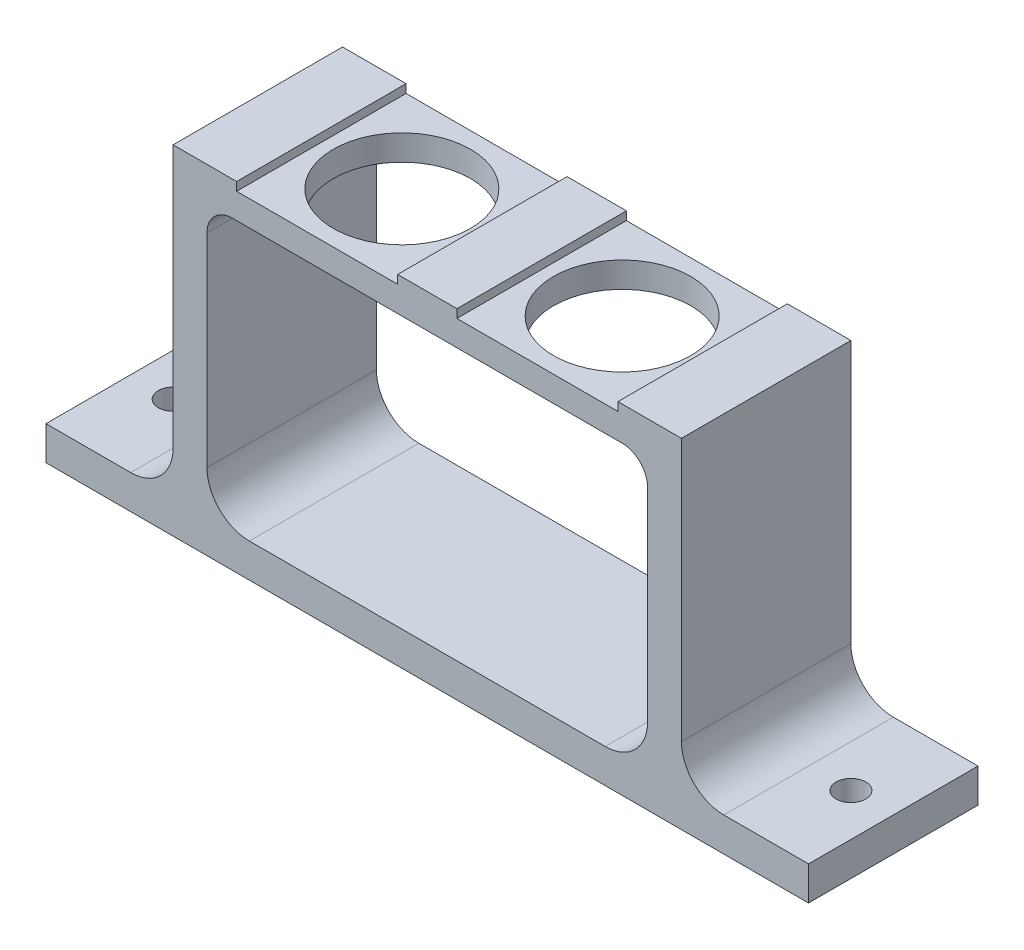
ISO-10303-21;
HEADER;
FILE_DESCRIPTION(('STEP AP214'),'2;1');
FILE_NAME('part.step','',(''),(''),'','','');
FILE_SCHEMA(('AUTOMOTIVE_DESIGN { 1 0 10303 214 1 1 1 1 }'));
ENDSEC;
DATA;
#1=APPLICATION_CONTEXT('core data for automotive mechanical design processes');
#2=APPLICATION_PROTOCOL_DEFINITION('international standard','automotive_design',2000,#1);
#3=PRODUCT_CONTEXT('',#1,'mechanical');
#4=PRODUCT('Part','Part','',(#3));
#5=PRODUCT_RELATED_PRODUCT_CATEGORY('part','',(#4));
#6=PRODUCT_DEFINITION_FORMATION('','',#4);
#7=PRODUCT_DEFINITION_CONTEXT('part definition',#1,'design');
#8=PRODUCT_DEFINITION('design','',#6,#7);
#9=PRODUCT_DEFINITION_SHAPE('','',#8);
#10=(LENGTH_UNIT() NAMED_UNIT(*) SI_UNIT(.MILLI.,.METRE.));
#11=(NAMED_UNIT(*) PLANE_ANGLE_UNIT() SI_UNIT($,.RADIAN.));
#12=(NAMED_UNIT(*) SI_UNIT($,.STERADIAN.) SOLID_ANGLE_UNIT());
#13=UNCERTAINTY_MEASURE_WITH_UNIT(LENGTH_MEASURE(1.E-05),#10,'distance_accuracy_value','');
#14=(GEOMETRIC_REPRESENTATION_CONTEXT(3) GLOBAL_UNCERTAINTY_ASSIGNED_CONTEXT((#13)) GLOBAL_UNIT_ASSIGNED_CONTEXT((#10,
#11,#12)) REPRESENTATION_CONTEXT('',''));
#15=CARTESIAN_POINT('',(0.,0.,0.));
#16=DIRECTION('',(0.,0.,1.));
#17=DIRECTION('',(1.,0.,0.));
#18=AXIS2_PLACEMENT_3D('',#15,#16,#17);
#19=CARTESIAN_POINT('',(0.,40.,0.));
#20=DIRECTION('',(0.,1.,0.));
#21=DIRECTION('',(0.,0.,1.));
#22=AXIS2_PLACEMENT_3D('',#19,#20,#21);
#23=PLANE('',#22);
#24=DIRECTION('',(0.,0.,-1.));
#25=VECTOR('',#24,1.);
#26=CARTESIAN_POINT('',(41.5,40.,0.));
#27=LINE('',#26,#25);
#28=CARTESIAN_POINT('',(41.5,40.,0.));
#29=VERTEX_POINT('',#28);
#30=CARTESIAN_POINT('',(41.5,40.,-20.));
#31=VERTEX_POINT('',#30);
#32=EDGE_CURVE('E213',#29,#31,#27,.T.);
#33=ORIENTED_EDGE('',*,*,#32,.F.);
#34=DIRECTION('',(1.,0.,0.));
#35=VECTOR('',#34,1.);
#36=CARTESIAN_POINT('',(15.,40.,0.));
#37=LINE('',#36,#35);
#38=CARTESIAN_POINT('',(48.5,40.,0.));
#39=VERTEX_POINT('',#38);
#40=EDGE_CURVE('E287',#29,#39,#37,.T.);
#41=ORIENTED_EDGE('',*,*,#40,.T.);
#42=DIRECTION('',(0.,0.,1.));
#43=VECTOR('',#42,1.);
#44=CARTESIAN_POINT('',(48.5,40.,0.));
#45=LINE('',#44,#43);
#46=CARTESIAN_POINT('',(48.5,40.,-20.));
#47=VERTEX_POINT('',#46);
#48=EDGE_CURVE('E251',#47,#39,#45,.T.);
#49=ORIENTED_EDGE('',*,*,#48,.F.);
#50=DIRECTION('',(-1.,0.,0.));
#51=VECTOR('',#50,1.);
#52=CARTESIAN_POINT('',(15.,40.,-20.));
#53=LINE('',#52,#51);
#54=EDGE_CURVE('E295',#47,#31,#53,.T.);
#55=ORIENTED_EDGE('',*,*,#54,.T.);
#56=EDGE_LOOP('',(#33,#41,#49,#55));
#57=FACE_BOUND('',#56,.T.);
#58=ADVANCED_FACE('F34',(#57),#23,.T.);
#59=DIRECTION('',(0.,0.,-1.));
#60=VECTOR('',#59,1.);
#61=CARTESIAN_POINT('',(67.5,40.,0.));
#62=LINE('',#61,#60);
#63=CARTESIAN_POINT('',(67.5,40.,0.));
#64=VERTEX_POINT('',#63);
#65=CARTESIAN_POINT('',(67.5,40.,-20.));
#66=VERTEX_POINT('',#65);
#67=EDGE_CURVE('E261',#64,#66,#62,.T.);
#68=ORIENTED_EDGE('',*,*,#67,.F.);
#69=CARTESIAN_POINT('',(75.,40.,0.));
#70=VERTEX_POINT('',#69);
#71=EDGE_CURVE('E281',#64,#70,#37,.T.);
#72=ORIENTED_EDGE('',*,*,#71,.T.);
#73=DIRECTION('',(0.,0.,-1.));
#74=VECTOR('',#73,1.);
#75=CARTESIAN_POINT('',(75.,40.,-20.));
#76=LINE('',#75,#74);
#77=CARTESIAN_POINT('',(75.,40.,-20.));
#78=VERTEX_POINT('',#77);
#79=EDGE_CURVE('E286',#70,#78,#76,.T.);
#80=ORIENTED_EDGE('',*,*,#79,.T.);
#81=EDGE_CURVE('E291',#78,#66,#53,.T.);
#82=ORIENTED_EDGE('',*,*,#81,.T.);
#83=EDGE_LOOP('',(#68,#72,#80,#82));
#84=FACE_BOUND('',#83,.T.);
#85=ADVANCED_FACE('F495',(#84),#23,.T.);
#86=CARTESIAN_POINT('',(0.,4.,0.));
#87=DIRECTION('',(0.,-1.,0.));
#88=DIRECTION('',(0.,0.,-1.));
#89=AXIS2_PLACEMENT_3D('',#86,#87,#88);
#90=PLANE('',#89);
#91=CARTESIAN_POINT('',(85.,4.,-10.));
#92=DIRECTION('',(0.,1.,0.));
#93=DIRECTION('',(0.,0.,1.));
#94=AXIS2_PLACEMENT_3D('',#91,#92,#93);
#95=CIRCLE('',#94,1.75);
#96=CARTESIAN_POINT('',(85.,4.,-8.25000000000001));
#97=VERTEX_POINT('',#96);
#98=EDGE_CURVE('E326',#97,#97,#95,.T.);
#99=ORIENTED_EDGE('',*,*,#98,.F.);
#100=EDGE_LOOP('',(#99));
#101=FACE_BOUND('',#100,.T.);
#102=DIRECTION('',(-1.,0.,0.));
#103=VECTOR('',#102,1.);
#104=CARTESIAN_POINT('',(0.,4.,-20.));
#105=LINE('',#104,#103);
#106=CARTESIAN_POINT('',(90.,4.,-20.));
#107=VERTEX_POINT('',#106);
#108=CARTESIAN_POINT('',(80.,4.,-20.));
#109=VERTEX_POINT('',#108);
#110=EDGE_CURVE('E344',#107,#109,#105,.T.);
#111=ORIENTED_EDGE('',*,*,#110,.T.);
#112=DIRECTION('',(0.,0.,-1.));
#113=VECTOR('',#112,1.);
#114=CARTESIAN_POINT('',(80.,4.,0.));
#115=LINE('',#114,#113);
#116=CARTESIAN_POINT('',(80.,4.,0.));
#117=VERTEX_POINT('',#116);
#118=EDGE_CURVE('E370',#109,#117,#115,.F.);
#119=ORIENTED_EDGE('',*,*,#118,.T.);
#120=DIRECTION('',(1.,0.,0.));
#121=VECTOR('',#120,1.);
#122=CARTESIAN_POINT('',(0.,4.,0.));
#123=LINE('',#122,#121);
#124=CARTESIAN_POINT('',(90.,4.,0.));
#125=VERTEX_POINT('',#124);
#126=EDGE_CURVE('E335',#117,#125,#123,.T.);
#127=ORIENTED_EDGE('',*,*,#126,.T.);
#128=DIRECTION('',(0.,0.,-1.));
#129=VECTOR('',#128,1.);
#130=CARTESIAN_POINT('',(90.,4.,0.));
#131=LINE('',#130,#129);
#132=EDGE_CURVE('E340',#125,#107,#131,.T.);
#133=ORIENTED_EDGE('',*,*,#132,.T.);
#134=EDGE_LOOP('',(#111,#119,#127,#133));
#135=FACE_BOUND('',#134,.T.);
#136=ADVANCED_FACE('F472',(#101,#135),#90,.F.);
#137=CARTESIAN_POINT('',(24.,4.,0.));
#138=VERTEX_POINT('',#137);
#139=CARTESIAN_POINT('',(66.,4.,0.));
#140=VERTEX_POINT('',#139);
#141=EDGE_CURVE('E341',#138,#140,#123,.T.);
#142=ORIENTED_EDGE('',*,*,#141,.T.);
#143=DIRECTION('',(0.,0.,1.));
#144=VECTOR('',#143,1.);
#145=CARTESIAN_POINT('',(66.,4.,-20.));
#146=LINE('',#145,#144);
#147=CARTESIAN_POINT('',(66.,4.,-20.));
#148=VERTEX_POINT('',#147);
#149=EDGE_CURVE('E377',#140,#148,#146,.F.);
#150=ORIENTED_EDGE('',*,*,#149,.T.);
#151=CARTESIAN_POINT('',(24.,4.,-20.));
#152=VERTEX_POINT('',#151);
#153=EDGE_CURVE('E348',#148,#152,#105,.T.);
#154=ORIENTED_EDGE('',*,*,#153,.T.);
#155=DIRECTION('',(0.,0.,-1.));
#156=VECTOR('',#155,1.);
#157=CARTESIAN_POINT('',(24.,4.,0.));
#158=LINE('',#157,#156);
#159=EDGE_CURVE('E375',#152,#138,#158,.F.);
#160=ORIENTED_EDGE('',*,*,#159,.T.);
#161=EDGE_LOOP('',(#142,#150,#154,#160));
#162=FACE_BOUND('',#161,.T.);
#163=ADVANCED_FACE('F465',(#162),#90,.F.);
#164=CARTESIAN_POINT('',(4.99999999999999,4.,-10.));
#165=DIRECTION('',(0.,1.,0.));
#166=DIRECTION('',(0.,0.,-1.));
#167=AXIS2_PLACEMENT_3D('',#164,#165,#166);
#168=CIRCLE('',#167,1.75);
#169=CARTESIAN_POINT('',(4.99999999999999,4.,-11.75));
#170=VERTEX_POINT('',#169);
#171=EDGE_CURVE('E320',#170,#170,#168,.T.);
#172=ORIENTED_EDGE('',*,*,#171,.F.);
#173=EDGE_LOOP('',(#172));
#174=FACE_BOUND('',#173,.T.);
#175=CARTESIAN_POINT('',(0.,4.,0.));
#176=VERTEX_POINT('',#175);
#177=CARTESIAN_POINT('',(9.99999999999998,4.,0.));
#178=VERTEX_POINT('',#177);
#179=EDGE_CURVE('E337',#176,#178,#123,.T.);
#180=ORIENTED_EDGE('',*,*,#179,.T.);
#181=DIRECTION('',(0.,0.,1.));
#182=VECTOR('',#181,1.);
#183=CARTESIAN_POINT('',(9.99999999999998,4.,-20.));
#184=LINE('',#183,#182);
#185=CARTESIAN_POINT('',(9.99999999999998,4.,-20.));
#186=VERTEX_POINT('',#185);
#187=EDGE_CURVE('E382',#178,#186,#184,.F.);
#188=ORIENTED_EDGE('',*,*,#187,.T.);
#189=CARTESIAN_POINT('',(0.,4.,-20.));
#190=VERTEX_POINT('',#189);
#191=EDGE_CURVE('E343',#186,#190,#105,.T.);
#192=ORIENTED_EDGE('',*,*,#191,.T.);
#193=DIRECTION('',(0.,0.,1.));
#194=VECTOR('',#193,1.);
#195=CARTESIAN_POINT('',(0.,4.,0.));
#196=LINE('',#195,#194);
#197=EDGE_CURVE('E332',#190,#176,#196,.T.);
#198=ORIENTED_EDGE('',*,*,#197,.T.);
#199=EDGE_LOOP('',(#180,#188,#192,#198));
#200=FACE_BOUND('',#199,.T.);
#201=ADVANCED_FACE('F709',(#174,#200),#90,.F.);
#202=CARTESIAN_POINT('',(0.,0.,0.));
#203=DIRECTION('',(0.,-1.,0.));
#204=DIRECTION('',(0.,0.,-1.));
#205=AXIS2_PLACEMENT_3D('',#202,#203,#204);
#206=PLANE('',#205);
#207=CARTESIAN_POINT('',(85.,0.,-10.));
#208=DIRECTION('',(0.,1.,0.));
#209=DIRECTION('',(0.,0.,1.));
#210=AXIS2_PLACEMENT_3D('',#207,#208,#209);
#211=CIRCLE('',#210,1.75);
#212=CARTESIAN_POINT('',(85.,0.,-8.25000000000001));
#213=VERTEX_POINT('',#212);
#214=EDGE_CURVE('E323',#213,#213,#211,.T.);
#215=ORIENTED_EDGE('',*,*,#214,.T.);
#216=EDGE_LOOP('',(#215));
#217=FACE_BOUND('',#216,.T.);
#218=DIRECTION('',(0.,0.,1.));
#219=VECTOR('',#218,1.);
#220=CARTESIAN_POINT('',(0.,0.,0.));
#221=LINE('',#220,#219);
#222=CARTESIAN_POINT('',(0.,0.,-20.));
#223=VERTEX_POINT('',#222);
#224=CARTESIAN_POINT('',(0.,0.,0.));
#225=VERTEX_POINT('',#224);
#226=EDGE_CURVE('E329',#223,#225,#221,.T.);
#227=ORIENTED_EDGE('',*,*,#226,.F.);
#228=DIRECTION('',(-1.,0.,0.));
#229=VECTOR('',#228,1.);
#230=CARTESIAN_POINT('',(0.,0.,-20.));
#231=LINE('',#230,#229);
#232=CARTESIAN_POINT('',(90.,0.,-20.));
#233=VERTEX_POINT('',#232);
#234=EDGE_CURVE('E336',#233,#223,#231,.T.);
#235=ORIENTED_EDGE('',*,*,#234,.F.);
#236=DIRECTION('',(0.,0.,-1.));
#237=VECTOR('',#236,1.);
#238=CARTESIAN_POINT('',(90.,0.,0.));
#239=LINE('',#238,#237);
#240=CARTESIAN_POINT('',(90.,0.,0.));
#241=VERTEX_POINT('',#240);
#242=EDGE_CURVE('E353',#241,#233,#239,.T.);
#243=ORIENTED_EDGE('',*,*,#242,.F.);
#244=DIRECTION('',(1.,0.,0.));
#245=VECTOR('',#244,1.);
#246=CARTESIAN_POINT('',(0.,0.,0.));
#247=LINE('',#246,#245);
#248=EDGE_CURVE('E351',#225,#241,#247,.T.);
#249=ORIENTED_EDGE('',*,*,#248,.F.);
#250=EDGE_LOOP('',(#227,#235,#243,#249));
#251=FACE_BOUND('',#250,.T.);
#252=CARTESIAN_POINT('',(4.99999999999999,0.,-10.));
#253=DIRECTION('',(0.,1.,0.));
#254=DIRECTION('',(0.,0.,-1.));
#255=AXIS2_PLACEMENT_3D('',#252,#253,#254);
#256=CIRCLE('',#255,1.75);
#257=CARTESIAN_POINT('',(4.99999999999999,0.,-11.75));
#258=VERTEX_POINT('',#257);
#259=EDGE_CURVE('E319',#258,#258,#256,.T.);
#260=ORIENTED_EDGE('',*,*,#259,.T.);
#261=EDGE_LOOP('',(#260));
#262=FACE_BOUND('',#261,.T.);
#263=ADVANCED_FACE('F714',(#217,#251,#262),#206,.T.);
#264=CARTESIAN_POINT('',(0.,4.,0.));
#265=DIRECTION('',(1.,0.,0.));
#266=DIRECTION('',(0.,0.,-1.));
#267=AXIS2_PLACEMENT_3D('',#264,#265,#266);
#268=PLANE('',#267);
#269=ORIENTED_EDGE('',*,*,#226,.T.);
#270=DIRECTION('',(0.,-1.,0.));
#271=VECTOR('',#270,1.);
#272=CARTESIAN_POINT('',(0.,4.,0.));
#273=LINE('',#272,#271);
#274=EDGE_CURVE('E364',#176,#225,#273,.T.);
#275=ORIENTED_EDGE('',*,*,#274,.F.);
#276=ORIENTED_EDGE('',*,*,#197,.F.);
#277=DIRECTION('',(0.,-1.,0.));
#278=VECTOR('',#277,1.);
#279=CARTESIAN_POINT('',(0.,4.,-20.));
#280=LINE('',#279,#278);
#281=EDGE_CURVE('E347',#190,#223,#280,.T.);
#282=ORIENTED_EDGE('',*,*,#281,.T.);
#283=EDGE_LOOP('',(#269,#275,#276,#282));
#284=FACE_BOUND('',#283,.T.);
#285=ADVANCED_FACE('F602',(#284),#268,.F.);
#286=CARTESIAN_POINT('',(0.,4.,0.));
#287=DIRECTION('',(0.,0.,-1.));
#288=DIRECTION('',(-1.,0.,0.));
#289=AXIS2_PLACEMENT_3D('',#286,#287,#288);
#290=PLANE('',#289);
#291=ORIENTED_EDGE('',*,*,#40,.F.);
#292=DIRECTION('',(0.,1.,0.));
#293=VECTOR('',#292,1.);
#294=CARTESIAN_POINT('',(41.5,39.,0.));
#295=LINE('',#294,#293);
#296=CARTESIAN_POINT('',(41.5,39.,0.));
#297=VERTEX_POINT('',#296);
#298=EDGE_CURVE('E240',#297,#29,#295,.T.);
#299=ORIENTED_EDGE('',*,*,#298,.F.);
#300=DIRECTION('',(1.,0.,0.));
#301=VECTOR('',#300,1.);
#302=CARTESIAN_POINT('',(22.5,39.,0.));
#303=LINE('',#302,#301);
#304=CARTESIAN_POINT('',(22.5,39.,0.));
#305=VERTEX_POINT('',#304);
#306=EDGE_CURVE('E218',#305,#297,#303,.T.);
#307=ORIENTED_EDGE('',*,*,#306,.F.);
#308=DIRECTION('',(0.,1.,0.));
#309=VECTOR('',#308,1.);
#310=CARTESIAN_POINT('',(22.5,39.,0.));
#311=LINE('',#310,#309);
#312=CARTESIAN_POINT('',(22.5,40.,0.));
#313=VERTEX_POINT('',#312);
#314=EDGE_CURVE('E243',#305,#313,#311,.T.);
#315=ORIENTED_EDGE('',*,*,#314,.T.);
#316=CARTESIAN_POINT('',(15.,40.,0.));
#317=VERTEX_POINT('',#316);
#318=EDGE_CURVE('E283',#317,#313,#37,.T.);
#319=ORIENTED_EDGE('',*,*,#318,.F.);
#320=DIRECTION('',(0.,-1.,0.));
#321=VECTOR('',#320,1.);
#322=CARTESIAN_POINT('',(15.,36.,0.));
#323=LINE('',#322,#321);
#324=CARTESIAN_POINT('',(15.,9.,0.));
#325=VERTEX_POINT('',#324);
#326=EDGE_CURVE('E316',#317,#325,#323,.T.);
#327=ORIENTED_EDGE('',*,*,#326,.T.);
#328=CARTESIAN_POINT('',(9.99999999999999,9.,0.));
#329=DIRECTION('',(0.,0.,-1.));
#330=DIRECTION('',(-1.,0.,0.));
#331=AXIS2_PLACEMENT_3D('',#328,#329,#330);
#332=CIRCLE('',#331,5.);
#333=EDGE_CURVE('E396',#325,#178,#332,.T.);
#334=ORIENTED_EDGE('',*,*,#333,.T.);
#335=ORIENTED_EDGE('',*,*,#179,.F.);
#336=ORIENTED_EDGE('',*,*,#274,.T.);
#337=ORIENTED_EDGE('',*,*,#248,.T.);
#338=DIRECTION('',(0.,-1.,0.));
#339=VECTOR('',#338,1.);
#340=CARTESIAN_POINT('',(90.,4.,0.));
#341=LINE('',#340,#339);
#342=EDGE_CURVE('E361',#125,#241,#341,.T.);
#343=ORIENTED_EDGE('',*,*,#342,.F.);
#344=ORIENTED_EDGE('',*,*,#126,.F.);
#345=CARTESIAN_POINT('',(80.,9.,0.));
#346=DIRECTION('',(0.,0.,-1.));
#347=DIRECTION('',(-1.,0.,0.));
#348=AXIS2_PLACEMENT_3D('',#345,#346,#347);
#349=CIRCLE('',#348,5.);
#350=CARTESIAN_POINT('',(75.,9.,0.));
#351=VERTEX_POINT('',#350);
#352=EDGE_CURVE('E389',#117,#351,#349,.T.);
#353=ORIENTED_EDGE('',*,*,#352,.T.);
#354=DIRECTION('',(0.,-1.,0.));
#355=VECTOR('',#354,1.);
#356=CARTESIAN_POINT('',(75.,36.,0.));
#357=LINE('',#356,#355);
#358=EDGE_CURVE('E306',#70,#351,#357,.T.);
#359=ORIENTED_EDGE('',*,*,#358,.F.);
#360=ORIENTED_EDGE('',*,*,#71,.F.);
#361=DIRECTION('',(0.,1.,0.));
#362=VECTOR('',#361,1.);
#363=CARTESIAN_POINT('',(67.5,39.,0.));
#364=LINE('',#363,#362);
#365=CARTESIAN_POINT('',(67.5,39.,0.));
#366=VERTEX_POINT('',#365);
#367=EDGE_CURVE('E238',#366,#64,#364,.T.);
#368=ORIENTED_EDGE('',*,*,#367,.F.);
#369=DIRECTION('',(1.,0.,0.));
#370=VECTOR('',#369,1.);
#371=CARTESIAN_POINT('',(48.5,39.,0.));
#372=LINE('',#371,#370);
#373=CARTESIAN_POINT('',(48.5,39.,0.));
#374=VERTEX_POINT('',#373);
#375=EDGE_CURVE('E257',#374,#366,#372,.T.);
#376=ORIENTED_EDGE('',*,*,#375,.F.);
#377=DIRECTION('',(0.,1.,0.));
#378=VECTOR('',#377,1.);
#379=CARTESIAN_POINT('',(48.5,39.,0.));
#380=LINE('',#379,#378);
#381=EDGE_CURVE('E265',#374,#39,#380,.T.);
#382=ORIENTED_EDGE('',*,*,#381,.T.);
#383=EDGE_LOOP('',(#291,#299,#307,#315,#319,#327,#334,#335,#336,#337,#343,#344,#353,#359,#360,
#368,#376,#382));
#384=FACE_BOUND('',#383,.T.);
#385=DIRECTION('',(0.,-1.,0.));
#386=VECTOR('',#385,1.);
#387=CARTESIAN_POINT('',(19.,36.,0.));
#388=LINE('',#387,#386);
#389=CARTESIAN_POINT('',(19.,33.,0.));
#390=VERTEX_POINT('',#389);
#391=CARTESIAN_POINT('',(19.,9.,0.));
#392=VERTEX_POINT('',#391);
#393=EDGE_CURVE('E314',#390,#392,#388,.T.);
#394=ORIENTED_EDGE('',*,*,#393,.F.);
#395=CARTESIAN_POINT('',(22.,33.,0.));
#396=DIRECTION('',(0.,0.,-1.));
#397=DIRECTION('',(-1.,0.,0.));
#398=AXIS2_PLACEMENT_3D('',#395,#396,#397);
#399=CIRCLE('',#398,3.);
#400=CARTESIAN_POINT('',(22.,36.,0.));
#401=VERTEX_POINT('',#400);
#402=EDGE_CURVE('E11',#390,#401,#399,.T.);
#403=ORIENTED_EDGE('',*,*,#402,.T.);
#404=DIRECTION('',(1.,0.,0.));
#405=VECTOR('',#404,1.);
#406=CARTESIAN_POINT('',(15.,36.,0.));
#407=LINE('',#406,#405);
#408=CARTESIAN_POINT('',(68.,36.,0.));
#409=VERTEX_POINT('',#408);
#410=EDGE_CURVE('E277',#401,#409,#407,.T.);
#411=ORIENTED_EDGE('',*,*,#410,.T.);
#412=CARTESIAN_POINT('',(68.,33.,0.));
#413=DIRECTION('',(0.,0.,-1.));
#414=DIRECTION('',(-1.,0.,0.));
#415=AXIS2_PLACEMENT_3D('',#412,#413,#414);
#416=CIRCLE('',#415,3.);
#417=CARTESIAN_POINT('',(71.,33.,0.));
#418=VERTEX_POINT('',#417);
#419=EDGE_CURVE('E415',#409,#418,#416,.T.);
#420=ORIENTED_EDGE('',*,*,#419,.T.);
#421=DIRECTION('',(0.,-1.,0.));
#422=VECTOR('',#421,1.);
#423=CARTESIAN_POINT('',(71.,36.,0.));
#424=LINE('',#423,#422);
#425=CARTESIAN_POINT('',(71.,9.,0.));
#426=VERTEX_POINT('',#425);
#427=EDGE_CURVE('E294',#418,#426,#424,.T.);
#428=ORIENTED_EDGE('',*,*,#427,.T.);
#429=CARTESIAN_POINT('',(66.,9.,0.));
#430=DIRECTION('',(0.,0.,-1.));
#431=DIRECTION('',(-1.,0.,0.));
#432=AXIS2_PLACEMENT_3D('',#429,#430,#431);
#433=CIRCLE('',#432,5.);
#434=EDGE_CURVE('E391',#426,#140,#433,.T.);
#435=ORIENTED_EDGE('',*,*,#434,.T.);
#436=ORIENTED_EDGE('',*,*,#141,.F.);
#437=CARTESIAN_POINT('',(24.,9.,0.));
#438=DIRECTION('',(0.,0.,-1.));
#439=DIRECTION('',(-1.,0.,0.));
#440=AXIS2_PLACEMENT_3D('',#437,#438,#439);
#441=CIRCLE('',#440,5.);
#442=EDGE_CURVE('E402',#138,#392,#441,.T.);
#443=ORIENTED_EDGE('',*,*,#442,.T.);
#444=EDGE_LOOP('',(#394,#403,#411,#420,#428,#435,#436,#443));
#445=FACE_BOUND('',#444,.T.);
#446=ADVANCED_FACE('F452',(#384,#445),#290,.F.);
#447=CARTESIAN_POINT('',(90.,4.,0.));
#448=DIRECTION('',(-1.,0.,0.));
#449=DIRECTION('',(0.,0.,1.));
#450=AXIS2_PLACEMENT_3D('',#447,#448,#449);
#451=PLANE('',#450);
#452=ORIENTED_EDGE('',*,*,#242,.T.);
#453=DIRECTION('',(0.,-1.,0.));
#454=VECTOR('',#453,1.);
#455=CARTESIAN_POINT('',(90.,4.,-20.));
#456=LINE('',#455,#454);
#457=EDGE_CURVE('E358',#107,#233,#456,.T.);
#458=ORIENTED_EDGE('',*,*,#457,.F.);
#459=ORIENTED_EDGE('',*,*,#132,.F.);
#460=ORIENTED_EDGE('',*,*,#342,.T.);
#461=EDGE_LOOP('',(#452,#458,#459,#460));
#462=FACE_BOUND('',#461,.T.);
#463=ADVANCED_FACE('F481',(#462),#451,.F.);
#464=CARTESIAN_POINT('',(0.,4.,-20.));
#465=DIRECTION('',(0.,0.,1.));
#466=DIRECTION('',(1.,0.,0.));
#467=AXIS2_PLACEMENT_3D('',#464,#465,#466);
#468=PLANE('',#467);
#469=DIRECTION('',(-1.,0.,0.));
#470=VECTOR('',#469,1.);
#471=CARTESIAN_POINT('',(22.5,39.,-20.));
#472=LINE('',#471,#470);
#473=CARTESIAN_POINT('',(41.5,39.,-20.));
#474=VERTEX_POINT('',#473);
#475=CARTESIAN_POINT('',(22.5,39.,-20.));
#476=VERTEX_POINT('',#475);
#477=EDGE_CURVE('E224',#474,#476,#472,.T.);
#478=ORIENTED_EDGE('',*,*,#477,.F.);
#479=DIRECTION('',(0.,1.,0.));
#480=VECTOR('',#479,1.);
#481=CARTESIAN_POINT('',(41.5,39.,-20.));
#482=LINE('',#481,#480);
#483=EDGE_CURVE('E207',#474,#31,#482,.T.);
#484=ORIENTED_EDGE('',*,*,#483,.T.);
#485=ORIENTED_EDGE('',*,*,#54,.F.);
#486=DIRECTION('',(0.,1.,0.));
#487=VECTOR('',#486,1.);
#488=CARTESIAN_POINT('',(48.5,39.,-20.));
#489=LINE('',#488,#487);
#490=CARTESIAN_POINT('',(48.5,39.,-20.));
#491=VERTEX_POINT('',#490);
#492=EDGE_CURVE('E59',#491,#47,#489,.T.);
#493=ORIENTED_EDGE('',*,*,#492,.F.);
#494=DIRECTION('',(-1.,0.,0.));
#495=VECTOR('',#494,1.);
#496=CARTESIAN_POINT('',(48.5,39.,-20.));
#497=LINE('',#496,#495);
#498=CARTESIAN_POINT('',(67.5,39.,-20.));
#499=VERTEX_POINT('',#498);
#500=EDGE_CURVE('E250',#499,#491,#497,.T.);
#501=ORIENTED_EDGE('',*,*,#500,.F.);
#502=DIRECTION('',(0.,1.,0.));
#503=VECTOR('',#502,1.);
#504=CARTESIAN_POINT('',(67.5,39.,-20.));
#505=LINE('',#504,#503);
#506=EDGE_CURVE('E260',#499,#66,#505,.T.);
#507=ORIENTED_EDGE('',*,*,#506,.T.);
#508=ORIENTED_EDGE('',*,*,#81,.F.);
#509=DIRECTION('',(0.,-1.,0.));
#510=VECTOR('',#509,1.);
#511=CARTESIAN_POINT('',(75.,36.,-20.));
#512=LINE('',#511,#510);
#513=CARTESIAN_POINT('',(75.,9.,-20.));
#514=VERTEX_POINT('',#513);
#515=EDGE_CURVE('E303',#78,#514,#512,.T.);
#516=ORIENTED_EDGE('',*,*,#515,.T.);
#517=CARTESIAN_POINT('',(80.,9.,-20.));
#518=DIRECTION('',(0.,0.,1.));
#519=DIRECTION('',(1.,0.,0.));
#520=AXIS2_PLACEMENT_3D('',#517,#518,#519);
#521=CIRCLE('',#520,5.);
#522=EDGE_CURVE('E387',#514,#109,#521,.T.);
#523=ORIENTED_EDGE('',*,*,#522,.T.);
#524=ORIENTED_EDGE('',*,*,#110,.F.);
#525=ORIENTED_EDGE('',*,*,#457,.T.);
#526=ORIENTED_EDGE('',*,*,#234,.T.);
#527=ORIENTED_EDGE('',*,*,#281,.F.);
#528=ORIENTED_EDGE('',*,*,#191,.F.);
#529=CARTESIAN_POINT('',(9.99999999999998,9.,-20.));
#530=DIRECTION('',(0.,0.,1.));
#531=DIRECTION('',(1.,0.,0.));
#532=AXIS2_PLACEMENT_3D('',#529,#530,#531);
#533=CIRCLE('',#532,5.);
#534=CARTESIAN_POINT('',(15.,9.,-20.));
#535=VERTEX_POINT('',#534);
#536=EDGE_CURVE('E398',#186,#535,#533,.T.);
#537=ORIENTED_EDGE('',*,*,#536,.T.);
#538=DIRECTION('',(0.,-1.,0.));
#539=VECTOR('',#538,1.);
#540=CARTESIAN_POINT('',(15.,36.,-20.));
#541=LINE('',#540,#539);
#542=CARTESIAN_POINT('',(15.,40.,-20.));
#543=VERTEX_POINT('',#542);
#544=EDGE_CURVE('E309',#543,#535,#541,.T.);
#545=ORIENTED_EDGE('',*,*,#544,.F.);
#546=CARTESIAN_POINT('',(22.5,40.,-20.));
#547=VERTEX_POINT('',#546);
#548=EDGE_CURVE('E290',#547,#543,#53,.T.);
#549=ORIENTED_EDGE('',*,*,#548,.F.);
#550=DIRECTION('',(0.,1.,0.));
#551=VECTOR('',#550,1.);
#552=CARTESIAN_POINT('',(22.5,39.,-20.));
#553=LINE('',#552,#551);
#554=EDGE_CURVE('E51',#476,#547,#553,.T.);
#555=ORIENTED_EDGE('',*,*,#554,.F.);
#556=EDGE_LOOP('',(#478,#484,#485,#493,#501,#507,#508,#516,#523,#524,#525,#526,#527,#528,#537,
#545,#549,#555));
#557=FACE_BOUND('',#556,.T.);
#558=DIRECTION('',(0.,-1.,0.));
#559=VECTOR('',#558,1.);
#560=CARTESIAN_POINT('',(71.,36.,-20.));
#561=LINE('',#560,#559);
#562=CARTESIAN_POINT('',(71.,33.,-20.));
#563=VERTEX_POINT('',#562);
#564=CARTESIAN_POINT('',(71.,9.,-20.));
#565=VERTEX_POINT('',#564);
#566=EDGE_CURVE('E301',#563,#565,#561,.T.);
#567=ORIENTED_EDGE('',*,*,#566,.F.);
#568=CARTESIAN_POINT('',(68.,33.,-20.));
#569=DIRECTION('',(0.,0.,1.));
#570=DIRECTION('',(1.,0.,0.));
#571=AXIS2_PLACEMENT_3D('',#568,#569,#570);
#572=CIRCLE('',#571,3.);
#573=CARTESIAN_POINT('',(68.,36.,-20.));
#574=VERTEX_POINT('',#573);
#575=EDGE_CURVE('E417',#563,#574,#572,.T.);
#576=ORIENTED_EDGE('',*,*,#575,.T.);
#577=DIRECTION('',(-1.,0.,0.));
#578=VECTOR('',#577,1.);
#579=CARTESIAN_POINT('',(15.,36.,-20.));
#580=LINE('',#579,#578);
#581=CARTESIAN_POINT('',(22.,36.,-20.));
#582=VERTEX_POINT('',#581);
#583=EDGE_CURVE('E282',#574,#582,#580,.T.);
#584=ORIENTED_EDGE('',*,*,#583,.T.);
#585=CARTESIAN_POINT('',(22.,33.,-20.));
#586=DIRECTION('',(0.,0.,1.));
#587=DIRECTION('',(1.,0.,0.));
#588=AXIS2_PLACEMENT_3D('',#585,#586,#587);
#589=CIRCLE('',#588,3.);
#590=CARTESIAN_POINT('',(19.,33.,-20.));
#591=VERTEX_POINT('',#590);
#592=EDGE_CURVE('E43',#582,#591,#589,.T.);
#593=ORIENTED_EDGE('',*,*,#592,.T.);
#594=DIRECTION('',(0.,-1.,0.));
#595=VECTOR('',#594,1.);
#596=CARTESIAN_POINT('',(19.,36.,-20.));
#597=LINE('',#596,#595);
#598=CARTESIAN_POINT('',(19.,9.,-20.));
#599=VERTEX_POINT('',#598);
#600=EDGE_CURVE('E312',#591,#599,#597,.T.);
#601=ORIENTED_EDGE('',*,*,#600,.T.);
#602=CARTESIAN_POINT('',(24.,9.,-20.));
#603=DIRECTION('',(0.,0.,1.));
#604=DIRECTION('',(1.,0.,0.));
#605=AXIS2_PLACEMENT_3D('',#602,#603,#604);
#606=CIRCLE('',#605,5.);
#607=EDGE_CURVE('E400',#599,#152,#606,.T.);
#608=ORIENTED_EDGE('',*,*,#607,.T.);
#609=ORIENTED_EDGE('',*,*,#153,.F.);
#610=CARTESIAN_POINT('',(66.,9.,-20.));
#611=DIRECTION('',(0.,0.,1.));
#612=DIRECTION('',(1.,0.,0.));
#613=AXIS2_PLACEMENT_3D('',#610,#611,#612);
#614=CIRCLE('',#613,5.);
#615=EDGE_CURVE('E393',#148,#565,#614,.T.);
#616=ORIENTED_EDGE('',*,*,#615,.T.);
#617=EDGE_LOOP('',(#567,#576,#584,#593,#601,#608,#609,#616));
#618=FACE_BOUND('',#617,.T.);
#619=ADVANCED_FACE('F229',(#557,#618),#468,.F.);
#620=CARTESIAN_POINT('',(85.,4.,-10.));
#621=DIRECTION('',(0.,-1.,0.));
#622=DIRECTION('',(0.,0.,-1.));
#623=AXIS2_PLACEMENT_3D('',#620,#621,#622);
#624=CYLINDRICAL_SURFACE('',#623,1.75);
#625=ORIENTED_EDGE('',*,*,#98,.T.);
#626=EDGE_LOOP('',(#625));
#627=FACE_BOUND('',#626,.T.);
#628=ORIENTED_EDGE('',*,*,#214,.F.);
#629=EDGE_LOOP('',(#628));
#630=FACE_BOUND('',#629,.T.);
#631=ADVANCED_FACE('F589',(#627,#630),#624,.F.);
#632=CARTESIAN_POINT('',(4.99999999999999,4.,-10.));
#633=DIRECTION('',(0.,-1.,0.));
#634=DIRECTION('',(0.,0.,-1.));
#635=AXIS2_PLACEMENT_3D('',#632,#633,#634);
#636=CYLINDRICAL_SURFACE('',#635,1.75);
#637=ORIENTED_EDGE('',*,*,#171,.T.);
#638=EDGE_LOOP('',(#637));
#639=FACE_BOUND('',#638,.T.);
#640=ORIENTED_EDGE('',*,*,#259,.F.);
#641=EDGE_LOOP('',(#640));
#642=FACE_BOUND('',#641,.T.);
#643=ADVANCED_FACE('F703',(#639,#642),#636,.F.);
#644=CARTESIAN_POINT('',(15.,36.,-20.));
#645=DIRECTION('',(1.,0.,0.));
#646=DIRECTION('',(0.,0.,-1.));
#647=AXIS2_PLACEMENT_3D('',#644,#645,#646);
#648=PLANE('',#647);
#649=ORIENTED_EDGE('',*,*,#544,.T.);
#650=DIRECTION('',(0.,0.,1.));
#651=VECTOR('',#650,1.);
#652=CARTESIAN_POINT('',(15.,9.,0.));
#653=LINE('',#652,#651);
#654=EDGE_CURVE('E379',#535,#325,#653,.T.);
#655=ORIENTED_EDGE('',*,*,#654,.T.);
#656=ORIENTED_EDGE('',*,*,#326,.F.);
#657=DIRECTION('',(0.,0.,1.));
#658=VECTOR('',#657,1.);
#659=CARTESIAN_POINT('',(15.,40.,-20.));
#660=LINE('',#659,#658);
#661=EDGE_CURVE('E278',#543,#317,#660,.T.);
#662=ORIENTED_EDGE('',*,*,#661,.F.);
#663=EDGE_LOOP('',(#649,#655,#656,#662));
#664=FACE_BOUND('',#663,.T.);
#665=ADVANCED_FACE('F530',(#664),#648,.F.);
#666=CARTESIAN_POINT('',(19.,36.,-20.));
#667=DIRECTION('',(-1.,0.,0.));
#668=DIRECTION('',(0.,0.,1.));
#669=AXIS2_PLACEMENT_3D('',#666,#667,#668);
#670=PLANE('',#669);
#671=ORIENTED_EDGE('',*,*,#600,.F.);
#672=DIRECTION('',(0.,0.,-1.));
#673=VECTOR('',#672,1.);
#674=CARTESIAN_POINT('',(19.,33.,0.));
#675=LINE('',#674,#673);
#676=EDGE_CURVE('E413',#591,#390,#675,.F.);
#677=ORIENTED_EDGE('',*,*,#676,.T.);
#678=ORIENTED_EDGE('',*,*,#393,.T.);
#679=DIRECTION('',(0.,0.,-1.));
#680=VECTOR('',#679,1.);
#681=CARTESIAN_POINT('',(19.,9.,-20.));
#682=LINE('',#681,#680);
#683=EDGE_CURVE('E384',#392,#599,#682,.T.);
#684=ORIENTED_EDGE('',*,*,#683,.T.);
#685=EDGE_LOOP('',(#671,#677,#678,#684));
#686=FACE_BOUND('',#685,.T.);
#687=ADVANCED_FACE('F652',(#686),#670,.F.);
#688=CARTESIAN_POINT('',(75.,36.,-20.));
#689=DIRECTION('',(-1.,0.,0.));
#690=DIRECTION('',(0.,0.,1.));
#691=AXIS2_PLACEMENT_3D('',#688,#689,#690);
#692=PLANE('',#691);
#693=ORIENTED_EDGE('',*,*,#358,.T.);
#694=DIRECTION('',(0.,0.,-1.));
#695=VECTOR('',#694,1.);
#696=CARTESIAN_POINT('',(75.,9.,-20.));
#697=LINE('',#696,#695);
#698=EDGE_CURVE('E367',#351,#514,#697,.T.);
#699=ORIENTED_EDGE('',*,*,#698,.T.);
#700=ORIENTED_EDGE('',*,*,#515,.F.);
#701=ORIENTED_EDGE('',*,*,#79,.F.);
#702=EDGE_LOOP('',(#693,#699,#700,#701));
#703=FACE_BOUND('',#702,.T.);
#704=ADVANCED_FACE('F491',(#703),#692,.F.);
#705=CARTESIAN_POINT('',(71.,36.,0.));
#706=DIRECTION('',(1.,0.,0.));
#707=DIRECTION('',(0.,0.,-1.));
#708=AXIS2_PLACEMENT_3D('',#705,#706,#707);
#709=PLANE('',#708);
#710=ORIENTED_EDGE('',*,*,#427,.F.);
#711=DIRECTION('',(0.,0.,1.));
#712=VECTOR('',#711,1.);
#713=CARTESIAN_POINT('',(71.,33.,-20.));
#714=LINE('',#713,#712);
#715=EDGE_CURVE('E411',#418,#563,#714,.F.);
#716=ORIENTED_EDGE('',*,*,#715,.T.);
#717=ORIENTED_EDGE('',*,*,#566,.T.);
#718=DIRECTION('',(0.,0.,1.));
#719=VECTOR('',#718,1.);
#720=CARTESIAN_POINT('',(71.,9.,0.));
#721=LINE('',#720,#719);
#722=EDGE_CURVE('E372',#565,#426,#721,.T.);
#723=ORIENTED_EDGE('',*,*,#722,.T.);
#724=EDGE_LOOP('',(#710,#716,#717,#723));
#725=FACE_BOUND('',#724,.T.);
#726=ADVANCED_FACE('F437',(#725),#709,.F.);
#727=CARTESIAN_POINT('',(0.,36.,0.));
#728=DIRECTION('',(0.,1.,0.));
#729=DIRECTION('',(0.,0.,1.));
#730=AXIS2_PLACEMENT_3D('',#727,#728,#729);
#731=PLANE('',#730);
#732=CARTESIAN_POINT('',(32.,36.,-10.));
#733=DIRECTION('',(0.,1.,0.));
#734=DIRECTION('',(0.,0.,1.));
#735=AXIS2_PLACEMENT_3D('',#732,#733,#734);
#736=CIRCLE('',#735,8.10000000000001);
#737=CARTESIAN_POINT('',(32.,36.,-1.89999999999999));
#738=VERTEX_POINT('',#737);
#739=EDGE_CURVE('E274',#738,#738,#736,.T.);
#740=ORIENTED_EDGE('',*,*,#739,.T.);
#741=EDGE_LOOP('',(#740));
#742=FACE_BOUND('',#741,.T.);
#743=CARTESIAN_POINT('',(58.,36.,-10.));
#744=DIRECTION('',(0.,1.,0.));
#745=DIRECTION('',(0.,0.,1.));
#746=AXIS2_PLACEMENT_3D('',#743,#744,#745);
#747=CIRCLE('',#746,8.09999999999999);
#748=CARTESIAN_POINT('',(58.,36.,-1.90000000000001));
#749=VERTEX_POINT('',#748);
#750=EDGE_CURVE('E271',#749,#749,#747,.T.);
#751=ORIENTED_EDGE('',*,*,#750,.T.);
#752=EDGE_LOOP('',(#751));
#753=FACE_BOUND('',#752,.T.);
#754=ORIENTED_EDGE('',*,*,#583,.F.);
#755=DIRECTION('',(0.,0.,1.));
#756=VECTOR('',#755,1.);
#757=CARTESIAN_POINT('',(68.,36.,0.));
#758=LINE('',#757,#756);
#759=EDGE_CURVE('E408',#574,#409,#758,.T.);
#760=ORIENTED_EDGE('',*,*,#759,.T.);
#761=ORIENTED_EDGE('',*,*,#410,.F.);
#762=DIRECTION('',(0.,0.,-1.));
#763=VECTOR('',#762,1.);
#764=CARTESIAN_POINT('',(22.,36.,-20.));
#765=LINE('',#764,#763);
#766=EDGE_CURVE('E405',#401,#582,#765,.T.);
#767=ORIENTED_EDGE('',*,*,#766,.T.);
#768=EDGE_LOOP('',(#754,#760,#761,#767));
#769=FACE_BOUND('',#768,.T.);
#770=ADVANCED_FACE('F434',(#742,#753,#769),#731,.F.);
#771=DIRECTION('',(0.,0.,1.));
#772=VECTOR('',#771,1.);
#773=CARTESIAN_POINT('',(22.5,40.,0.));
#774=LINE('',#773,#772);
#775=EDGE_CURVE('E227',#547,#313,#774,.T.);
#776=ORIENTED_EDGE('',*,*,#775,.F.);
#777=ORIENTED_EDGE('',*,*,#548,.T.);
#778=ORIENTED_EDGE('',*,*,#661,.T.);
#779=ORIENTED_EDGE('',*,*,#318,.T.);
#780=EDGE_LOOP('',(#776,#777,#778,#779));
#781=FACE_BOUND('',#780,.T.);
#782=ADVANCED_FACE('F430',(#781),#23,.T.);
#783=CARTESIAN_POINT('',(32.,40.,-10.));
#784=DIRECTION('',(0.,-1.,0.));
#785=DIRECTION('',(0.,0.,-1.));
#786=AXIS2_PLACEMENT_3D('',#783,#784,#785);
#787=CYLINDRICAL_SURFACE('',#786,8.10000000000001);
#788=CARTESIAN_POINT('',(32.,39.,-10.));
#789=DIRECTION('',(0.,-1.,0.));
#790=DIRECTION('',(0.,0.,-1.));
#791=AXIS2_PLACEMENT_3D('',#788,#789,#790);
#792=CIRCLE('',#791,8.10000000000001);
#793=CARTESIAN_POINT('',(32.,39.,-18.1));
#794=VERTEX_POINT('',#793);
#795=EDGE_CURVE('E38',#794,#794,#792,.T.);
#796=ORIENTED_EDGE('',*,*,#795,.F.);
#797=EDGE_LOOP('',(#796));
#798=FACE_BOUND('',#797,.T.);
#799=ORIENTED_EDGE('',*,*,#739,.F.);
#800=EDGE_LOOP('',(#799));
#801=FACE_BOUND('',#800,.T.);
#802=ADVANCED_FACE('F426',(#798,#801),#787,.F.);
#803=CARTESIAN_POINT('',(58.,40.,-10.));
#804=DIRECTION('',(0.,-1.,0.));
#805=DIRECTION('',(0.,0.,-1.));
#806=AXIS2_PLACEMENT_3D('',#803,#804,#805);
#807=CYLINDRICAL_SURFACE('',#806,8.09999999999999);
#808=CARTESIAN_POINT('',(58.,39.,-10.));
#809=DIRECTION('',(0.,-1.,0.));
#810=DIRECTION('',(0.,0.,-1.));
#811=AXIS2_PLACEMENT_3D('',#808,#809,#810);
#812=CIRCLE('',#811,8.09999999999999);
#813=CARTESIAN_POINT('',(58.,39.,-18.1));
#814=VERTEX_POINT('',#813);
#815=EDGE_CURVE('E242',#814,#814,#812,.T.);
#816=ORIENTED_EDGE('',*,*,#815,.F.);
#817=EDGE_LOOP('',(#816));
#818=FACE_BOUND('',#817,.T.);
#819=ORIENTED_EDGE('',*,*,#750,.F.);
#820=EDGE_LOOP('',(#819));
#821=FACE_BOUND('',#820,.T.);
#822=ADVANCED_FACE('F429',(#818,#821),#807,.F.);
#823=CARTESIAN_POINT('',(80.,9.,-20.));
#824=DIRECTION('',(0.,0.,1.));
#825=DIRECTION('',(1.,0.,0.));
#826=AXIS2_PLACEMENT_3D('',#823,#824,#825);
#827=CYLINDRICAL_SURFACE('',#826,5.);
#828=ORIENTED_EDGE('',*,*,#352,.F.);
#829=ORIENTED_EDGE('',*,*,#118,.F.);
#830=ORIENTED_EDGE('',*,*,#522,.F.);
#831=ORIENTED_EDGE('',*,*,#698,.F.);
#832=EDGE_LOOP('',(#828,#829,#830,#831));
#833=FACE_BOUND('',#832,.T.);
#834=ADVANCED_FACE('F485',(#833),#827,.F.);
#835=CARTESIAN_POINT('',(66.,9.,0.));
#836=DIRECTION('',(0.,0.,-1.));
#837=DIRECTION('',(-1.,0.,0.));
#838=AXIS2_PLACEMENT_3D('',#835,#836,#837);
#839=CYLINDRICAL_SURFACE('',#838,5.);
#840=ORIENTED_EDGE('',*,*,#615,.F.);
#841=ORIENTED_EDGE('',*,*,#149,.F.);
#842=ORIENTED_EDGE('',*,*,#434,.F.);
#843=ORIENTED_EDGE('',*,*,#722,.F.);
#844=EDGE_LOOP('',(#840,#841,#842,#843));
#845=FACE_BOUND('',#844,.T.);
#846=ADVANCED_FACE('F459',(#845),#839,.F.);
#847=CARTESIAN_POINT('',(9.99999999999998,9.,-20.));
#848=DIRECTION('',(0.,0.,-1.));
#849=DIRECTION('',(-1.,0.,0.));
#850=AXIS2_PLACEMENT_3D('',#847,#848,#849);
#851=CYLINDRICAL_SURFACE('',#850,5.);
#852=ORIENTED_EDGE('',*,*,#536,.F.);
#853=ORIENTED_EDGE('',*,*,#187,.F.);
#854=ORIENTED_EDGE('',*,*,#333,.F.);
#855=ORIENTED_EDGE('',*,*,#654,.F.);
#856=EDGE_LOOP('',(#852,#853,#854,#855));
#857=FACE_BOUND('',#856,.T.);
#858=ADVANCED_FACE('F666',(#857),#851,.F.);
#859=CARTESIAN_POINT('',(24.,9.,-20.));
#860=DIRECTION('',(0.,0.,1.));
#861=DIRECTION('',(1.,0.,0.));
#862=AXIS2_PLACEMENT_3D('',#859,#860,#861);
#863=CYLINDRICAL_SURFACE('',#862,5.);
#864=ORIENTED_EDGE('',*,*,#442,.F.);
#865=ORIENTED_EDGE('',*,*,#159,.F.);
#866=ORIENTED_EDGE('',*,*,#607,.F.);
#867=ORIENTED_EDGE('',*,*,#683,.F.);
#868=EDGE_LOOP('',(#864,#865,#866,#867));
#869=FACE_BOUND('',#868,.T.);
#870=ADVANCED_FACE('F631',(#869),#863,.F.);
#871=CARTESIAN_POINT('',(68.,33.,0.));
#872=DIRECTION('',(0.,0.,-1.));
#873=DIRECTION('',(-1.,0.,0.));
#874=AXIS2_PLACEMENT_3D('',#871,#872,#873);
#875=CYLINDRICAL_SURFACE('',#874,3.);
#876=ORIENTED_EDGE('',*,*,#575,.F.);
#877=ORIENTED_EDGE('',*,*,#715,.F.);
#878=ORIENTED_EDGE('',*,*,#419,.F.);
#879=ORIENTED_EDGE('',*,*,#759,.F.);
#880=EDGE_LOOP('',(#876,#877,#878,#879));
#881=FACE_BOUND('',#880,.T.);
#882=ADVANCED_FACE('F447',(#881),#875,.F.);
#883=CARTESIAN_POINT('',(22.,33.,0.));
#884=DIRECTION('',(0.,0.,1.));
#885=DIRECTION('',(1.,0.,0.));
#886=AXIS2_PLACEMENT_3D('',#883,#884,#885);
#887=CYLINDRICAL_SURFACE('',#886,3.);
#888=ORIENTED_EDGE('',*,*,#402,.F.);
#889=ORIENTED_EDGE('',*,*,#676,.F.);
#890=ORIENTED_EDGE('',*,*,#592,.F.);
#891=ORIENTED_EDGE('',*,*,#766,.F.);
#892=EDGE_LOOP('',(#888,#889,#890,#891));
#893=FACE_BOUND('',#892,.T.);
#894=ADVANCED_FACE('F36',(#893),#887,.F.);
#895=CARTESIAN_POINT('',(67.5,39.,0.));
#896=DIRECTION('',(1.,0.,0.));
#897=DIRECTION('',(0.,0.,-1.));
#898=AXIS2_PLACEMENT_3D('',#895,#896,#897);
#899=PLANE('',#898);
#900=ORIENTED_EDGE('',*,*,#67,.T.);
#901=ORIENTED_EDGE('',*,*,#506,.F.);
#902=DIRECTION('',(0.,0.,-1.));
#903=VECTOR('',#902,1.);
#904=CARTESIAN_POINT('',(67.5,39.,0.));
#905=LINE('',#904,#903);
#906=EDGE_CURVE('E247',#366,#499,#905,.T.);
#907=ORIENTED_EDGE('',*,*,#906,.F.);
#908=ORIENTED_EDGE('',*,*,#367,.T.);
#909=EDGE_LOOP('',(#900,#901,#907,#908));
#910=FACE_BOUND('',#909,.T.);
#911=ADVANCED_FACE('F498',(#910),#899,.F.);
#912=CARTESIAN_POINT('',(48.5,39.,0.));
#913=DIRECTION('',(-1.,0.,0.));
#914=DIRECTION('',(0.,0.,1.));
#915=AXIS2_PLACEMENT_3D('',#912,#913,#914);
#916=PLANE('',#915);
#917=ORIENTED_EDGE('',*,*,#48,.T.);
#918=ORIENTED_EDGE('',*,*,#381,.F.);
#919=DIRECTION('',(0.,0.,1.));
#920=VECTOR('',#919,1.);
#921=CARTESIAN_POINT('',(48.5,39.,0.));
#922=LINE('',#921,#920);
#923=EDGE_CURVE('E254',#491,#374,#922,.T.);
#924=ORIENTED_EDGE('',*,*,#923,.F.);
#925=ORIENTED_EDGE('',*,*,#492,.T.);
#926=EDGE_LOOP('',(#917,#918,#924,#925));
#927=FACE_BOUND('',#926,.T.);
#928=ADVANCED_FACE('F505',(#927),#916,.F.);
#929=CARTESIAN_POINT('',(0.,39.,0.));
#930=DIRECTION('',(0.,-1.,0.));
#931=DIRECTION('',(0.,0.,-1.));
#932=AXIS2_PLACEMENT_3D('',#929,#930,#931);
#933=PLANE('',#932);
#934=ORIENTED_EDGE('',*,*,#815,.T.);
#935=EDGE_LOOP('',(#934));
#936=FACE_BOUND('',#935,.T.);
#937=ORIENTED_EDGE('',*,*,#906,.T.);
#938=ORIENTED_EDGE('',*,*,#500,.T.);
#939=ORIENTED_EDGE('',*,*,#923,.T.);
#940=ORIENTED_EDGE('',*,*,#375,.T.);
#941=EDGE_LOOP('',(#937,#938,#939,#940));
#942=FACE_BOUND('',#941,.T.);
#943=ADVANCED_FACE('F500',(#936,#942),#933,.F.);
#944=CARTESIAN_POINT('',(41.5,39.,0.));
#945=DIRECTION('',(1.,0.,0.));
#946=DIRECTION('',(0.,0.,-1.));
#947=AXIS2_PLACEMENT_3D('',#944,#945,#946);
#948=PLANE('',#947);
#949=ORIENTED_EDGE('',*,*,#32,.T.);
#950=ORIENTED_EDGE('',*,*,#483,.F.);
#951=DIRECTION('',(0.,0.,-1.));
#952=VECTOR('',#951,1.);
#953=CARTESIAN_POINT('',(41.5,39.,0.));
#954=LINE('',#953,#952);
#955=EDGE_CURVE('E210',#297,#474,#954,.T.);
#956=ORIENTED_EDGE('',*,*,#955,.F.);
#957=ORIENTED_EDGE('',*,*,#298,.T.);
#958=EDGE_LOOP('',(#949,#950,#956,#957));
#959=FACE_BOUND('',#958,.T.);
#960=ADVANCED_FACE('F209',(#959),#948,.F.);
#961=CARTESIAN_POINT('',(22.5,39.,0.));
#962=DIRECTION('',(-1.,0.,0.));
#963=DIRECTION('',(0.,0.,1.));
#964=AXIS2_PLACEMENT_3D('',#961,#962,#963);
#965=PLANE('',#964);
#966=ORIENTED_EDGE('',*,*,#775,.T.);
#967=ORIENTED_EDGE('',*,*,#314,.F.);
#968=DIRECTION('',(0.,0.,1.));
#969=VECTOR('',#968,1.);
#970=CARTESIAN_POINT('',(22.5,39.,0.));
#971=LINE('',#970,#969);
#972=EDGE_CURVE('E232',#476,#305,#971,.T.);
#973=ORIENTED_EDGE('',*,*,#972,.F.);
#974=ORIENTED_EDGE('',*,*,#554,.T.);
#975=EDGE_LOOP('',(#966,#967,#973,#974));
#976=FACE_BOUND('',#975,.T.);
#977=ADVANCED_FACE('F531',(#976),#965,.F.);
#978=CARTESIAN_POINT('',(0.,39.,0.));
#979=DIRECTION('',(0.,-1.,0.));
#980=DIRECTION('',(0.,0.,-1.));
#981=AXIS2_PLACEMENT_3D('',#978,#979,#980);
#982=PLANE('',#981);
#983=ORIENTED_EDGE('',*,*,#795,.T.);
#984=EDGE_LOOP('',(#983));
#985=FACE_BOUND('',#984,.T.);
#986=ORIENTED_EDGE('',*,*,#955,.T.);
#987=ORIENTED_EDGE('',*,*,#477,.T.);
#988=ORIENTED_EDGE('',*,*,#972,.T.);
#989=ORIENTED_EDGE('',*,*,#306,.T.);
#990=EDGE_LOOP('',(#986,#987,#988,#989));
#991=FACE_BOUND('',#990,.T.);
#992=ADVANCED_FACE('F222',(#985,#991),#982,.F.);
#993=CLOSED_SHELL('',(#58,#85,#136,#163,#201,#263,#285,#446,#463,#619,#631,#643,#665,#687,#704,
#726,#770,#782,#802,#822,#834,#846,#858,#870,#882,#894,#911,#928,#943,#960,#977,#992));
#994=MANIFOLD_SOLID_BREP('B2',#993);
#995=ADVANCED_BREP_SHAPE_REPRESENTATION('',(#18,#994),#14);
#996=SHAPE_DEFINITION_REPRESENTATION(#9,#995);
ENDSEC;
END-ISO-10303-21;
